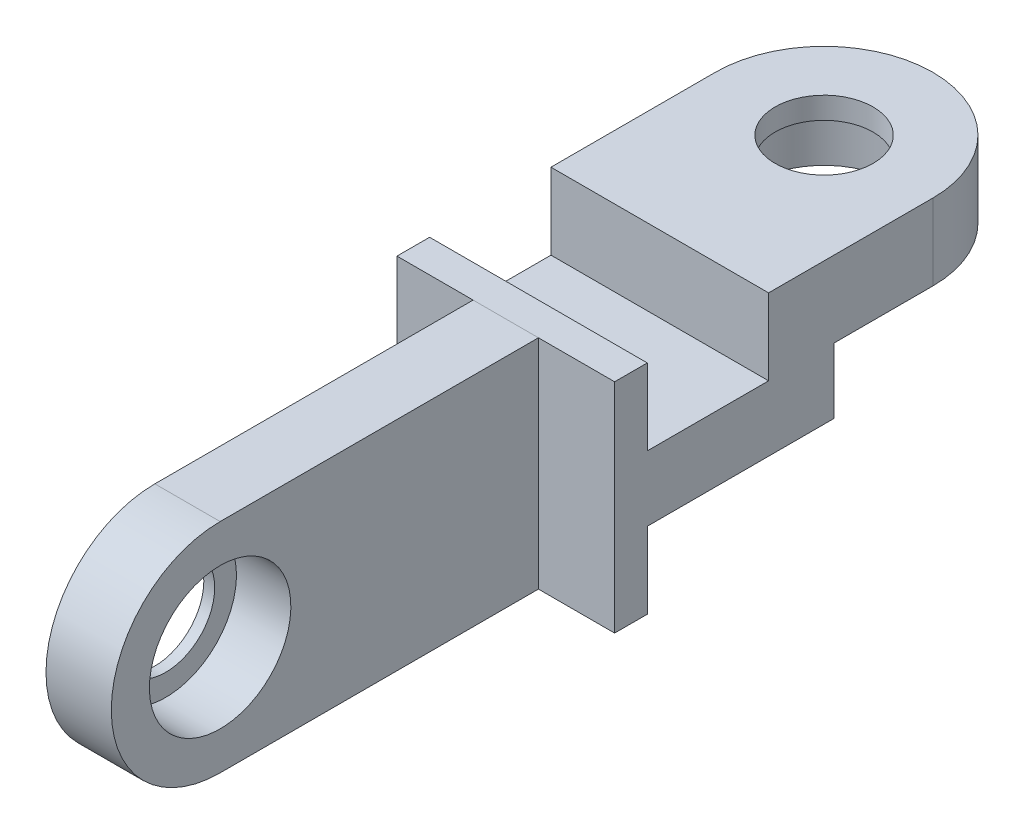
ISO-10303-21;
HEADER;
FILE_DESCRIPTION(('STEP AP214'),'2;1');
FILE_NAME('part.step','',(''),(''),'','','');
FILE_SCHEMA(('AUTOMOTIVE_DESIGN { 1 0 10303 214 1 1 1 1 }'));
ENDSEC;
DATA;
#1=APPLICATION_CONTEXT('core data for automotive mechanical design processes');
#2=APPLICATION_PROTOCOL_DEFINITION('international standard','automotive_design',2000,#1);
#3=PRODUCT_CONTEXT('',#1,'mechanical');
#4=PRODUCT('Part','Part','',(#3));
#5=PRODUCT_RELATED_PRODUCT_CATEGORY('part','',(#4));
#6=PRODUCT_DEFINITION_FORMATION('','',#4);
#7=PRODUCT_DEFINITION_CONTEXT('part definition',#1,'design');
#8=PRODUCT_DEFINITION('design','',#6,#7);
#9=PRODUCT_DEFINITION_SHAPE('','',#8);
#10=(LENGTH_UNIT() NAMED_UNIT(*) SI_UNIT(.MILLI.,.METRE.));
#11=(NAMED_UNIT(*) PLANE_ANGLE_UNIT() SI_UNIT($,.RADIAN.));
#12=(NAMED_UNIT(*) SI_UNIT($,.STERADIAN.) SOLID_ANGLE_UNIT());
#13=UNCERTAINTY_MEASURE_WITH_UNIT(LENGTH_MEASURE(1.E-05),#10,'distance_accuracy_value','');
#14=(GEOMETRIC_REPRESENTATION_CONTEXT(3) GLOBAL_UNCERTAINTY_ASSIGNED_CONTEXT((#13)) GLOBAL_UNIT_ASSIGNED_CONTEXT((#10,
#11,#12)) REPRESENTATION_CONTEXT('',''));
#15=CARTESIAN_POINT('',(0.,0.,0.));
#16=DIRECTION('',(0.,0.,1.));
#17=DIRECTION('',(1.,0.,0.));
#18=AXIS2_PLACEMENT_3D('',#15,#16,#17);
#19=CARTESIAN_POINT('',(-19.,0.,69.3946812691347));
#20=DIRECTION('',(1.,0.,0.));
#21=DIRECTION('',(0.,0.,-1.));
#22=AXIS2_PLACEMENT_3D('',#19,#20,#21);
#23=CYLINDRICAL_SURFACE('',#22,4.5);
#24=CARTESIAN_POINT('',(-3.,0.,69.3946812691347));
#25=DIRECTION('',(1.,0.,0.));
#26=DIRECTION('',(0.,0.,-1.));
#27=AXIS2_PLACEMENT_3D('',#24,#25,#26);
#28=CIRCLE('',#27,4.5);
#29=CARTESIAN_POINT('',(-3.,0.,64.8946812691347));
#30=VERTEX_POINT('',#29);
#31=EDGE_CURVE('E137',#30,#30,#28,.F.);
#32=ORIENTED_EDGE('',*,*,#31,.T.);
#33=EDGE_LOOP('',(#32));
#34=FACE_BOUND('',#33,.T.);
#35=CARTESIAN_POINT('',(-2.,0.,69.3946812691347));
#36=DIRECTION('',(1.,0.,0.));
#37=DIRECTION('',(0.,1.,0.));
#38=AXIS2_PLACEMENT_3D('',#35,#36,#37);
#39=CIRCLE('',#38,4.5);
#40=CARTESIAN_POINT('',(-2.00000000000001,4.49999999999999,69.3946812691347));
#41=VERTEX_POINT('',#40);
#42=EDGE_CURVE('E84',#41,#41,#39,.T.);
#43=ORIENTED_EDGE('',*,*,#42,.T.);
#44=EDGE_LOOP('',(#43));
#45=FACE_BOUND('',#44,.T.);
#46=ADVANCED_FACE('F80',(#34,#45),#23,.F.);
#47=CARTESIAN_POINT('',(0.,0.,40.1486937110615));
#48=DIRECTION('',(0.,0.,1.));
#49=DIRECTION('',(0.,1.,0.));
#50=AXIS2_PLACEMENT_3D('',#47,#48,#49);
#51=PLANE('',#50);
#52=DIRECTION('',(-1.,0.,0.));
#53=VECTOR('',#52,1.);
#54=CARTESIAN_POINT('',(-10.,9.99999999999997,40.1486937110615));
#55=LINE('',#54,#53);
#56=CARTESIAN_POINT('',(2.99999999999997,10.,40.1486937110615));
#57=VERTEX_POINT('',#56);
#58=CARTESIAN_POINT('',(-3.00000000000004,9.99999999999998,40.1486937110615));
#59=VERTEX_POINT('',#58);
#60=EDGE_CURVE('E14',#57,#59,#55,.T.);
#61=ORIENTED_EDGE('',*,*,#60,.F.);
#62=DIRECTION('',(0.,-1.,0.));
#63=VECTOR('',#62,1.);
#64=CARTESIAN_POINT('',(2.99999999999992,24.,40.1486937110615));
#65=LINE('',#64,#63);
#66=CARTESIAN_POINT('',(3.00000000000004,-9.99999999999999,40.1486937110615));
#67=VERTEX_POINT('',#66);
#68=EDGE_CURVE('E123',#57,#67,#65,.T.);
#69=ORIENTED_EDGE('',*,*,#68,.T.);
#70=DIRECTION('',(1.,0.,0.));
#71=VECTOR('',#70,1.);
#72=CARTESIAN_POINT('',(-9.99999999999996,-10.,40.1486937110615));
#73=LINE('',#72,#71);
#74=CARTESIAN_POINT('',(-2.99999999999997,-10.,40.1486937110615));
#75=VERTEX_POINT('',#74);
#76=EDGE_CURVE('E89',#75,#67,#73,.T.);
#77=ORIENTED_EDGE('',*,*,#76,.F.);
#78=DIRECTION('',(0.,-1.,0.));
#79=VECTOR('',#78,1.);
#80=CARTESIAN_POINT('',(-3.00000000000009,24.,40.1486937110615));
#81=LINE('',#80,#79);
#82=EDGE_CURVE('E104',#59,#75,#81,.T.);
#83=ORIENTED_EDGE('',*,*,#82,.F.);
#84=EDGE_LOOP('',(#61,#69,#77,#83));
#85=FACE_BOUND('',#84,.T.);
#86=ADVANCED_FACE('F82',(#85),#51,.F.);
#87=CARTESIAN_POINT('',(-19.,0.,69.3946812691347));
#88=DIRECTION('',(1.,0.,0.));
#89=DIRECTION('',(0.,0.,-1.));
#90=AXIS2_PLACEMENT_3D('',#87,#88,#89);
#91=CYLINDRICAL_SURFACE('',#90,10.);
#92=DIRECTION('',(1.,0.,0.));
#93=VECTOR('',#92,1.);
#94=CARTESIAN_POINT('',(-19.,-10.0000000000001,69.3946812691347));
#95=LINE('',#94,#93);
#96=CARTESIAN_POINT('',(-2.99999999999997,-10.,69.3946812691347));
#97=VERTEX_POINT('',#96);
#98=CARTESIAN_POINT('',(3.00000000000004,-9.99999999999999,69.3946812691347));
#99=VERTEX_POINT('',#98);
#100=EDGE_CURVE('E140',#97,#99,#95,.T.);
#101=ORIENTED_EDGE('',*,*,#100,.T.);
#102=CARTESIAN_POINT('',(3.,0.,69.3946812691347));
#103=DIRECTION('',(-1.,0.,0.));
#104=DIRECTION('',(0.,-1.,0.));
#105=AXIS2_PLACEMENT_3D('',#102,#103,#104);
#106=CIRCLE('',#105,10.);
#107=CARTESIAN_POINT('',(2.99999999999997,10.,69.3946812691347));
#108=VERTEX_POINT('',#107);
#109=EDGE_CURVE('E96',#99,#108,#106,.T.);
#110=ORIENTED_EDGE('',*,*,#109,.T.);
#111=DIRECTION('',(1.,0.,0.));
#112=VECTOR('',#111,1.);
#113=CARTESIAN_POINT('',(-19.,9.99999999999993,69.3946812691347));
#114=LINE('',#113,#112);
#115=CARTESIAN_POINT('',(-3.00000000000004,9.99999999999999,69.3946812691347));
#116=VERTEX_POINT('',#115);
#117=EDGE_CURVE('E144',#116,#108,#114,.T.);
#118=ORIENTED_EDGE('',*,*,#117,.F.);
#119=CARTESIAN_POINT('',(-3.,0.,69.3946812691347));
#120=DIRECTION('',(1.,0.,0.));
#121=DIRECTION('',(0.,1.,0.));
#122=AXIS2_PLACEMENT_3D('',#119,#120,#121);
#123=CIRCLE('',#122,10.);
#124=EDGE_CURVE('E150',#116,#97,#123,.T.);
#125=ORIENTED_EDGE('',*,*,#124,.T.);
#126=EDGE_LOOP('',(#101,#110,#118,#125));
#127=FACE_BOUND('',#126,.T.);
#128=ADVANCED_FACE('F183',(#127),#91,.T.);
#129=CARTESIAN_POINT('',(-10.,9.99999999999997,80.297387422123));
#130=DIRECTION('',(0.,-1.,0.));
#131=DIRECTION('',(1.,0.,0.));
#132=AXIS2_PLACEMENT_3D('',#129,#130,#131);
#133=PLANE('',#132);
#134=ORIENTED_EDGE('',*,*,#117,.T.);
#135=DIRECTION('',(0.,0.,-1.));
#136=VECTOR('',#135,1.);
#137=CARTESIAN_POINT('',(2.99999999999996,10.,80.297387422123));
#138=LINE('',#137,#136);
#139=EDGE_CURVE('E148',#108,#57,#138,.T.);
#140=ORIENTED_EDGE('',*,*,#139,.T.);
#141=ORIENTED_EDGE('',*,*,#60,.T.);
#142=DIRECTION('',(0.,0.,1.));
#143=VECTOR('',#142,1.);
#144=CARTESIAN_POINT('',(-3.00000000000004,9.99999999999999,80.297387422123));
#145=LINE('',#144,#143);
#146=EDGE_CURVE('E133',#59,#116,#145,.T.);
#147=ORIENTED_EDGE('',*,*,#146,.T.);
#148=EDGE_LOOP('',(#134,#140,#141,#147));
#149=FACE_BOUND('',#148,.T.);
#150=ADVANCED_FACE('F188',(#149),#133,.F.);
#151=CARTESIAN_POINT('',(-9.99999999999996,-10.,80.297387422123));
#152=DIRECTION('',(0.,1.,0.));
#153=DIRECTION('',(-1.,0.,0.));
#154=AXIS2_PLACEMENT_3D('',#151,#152,#153);
#155=PLANE('',#154);
#156=ORIENTED_EDGE('',*,*,#76,.T.);
#157=DIRECTION('',(0.,0.,-1.));
#158=VECTOR('',#157,1.);
#159=CARTESIAN_POINT('',(3.00000000000004,-9.99999999999999,79.3946812691347));
#160=LINE('',#159,#158);
#161=EDGE_CURVE('E120',#99,#67,#160,.T.);
#162=ORIENTED_EDGE('',*,*,#161,.F.);
#163=ORIENTED_EDGE('',*,*,#100,.F.);
#164=DIRECTION('',(0.,0.,1.));
#165=VECTOR('',#164,1.);
#166=CARTESIAN_POINT('',(-2.99999999999996,-10.,79.3946812691347));
#167=LINE('',#166,#165);
#168=EDGE_CURVE('E136',#75,#97,#167,.T.);
#169=ORIENTED_EDGE('',*,*,#168,.F.);
#170=EDGE_LOOP('',(#156,#162,#163,#169));
#171=FACE_BOUND('',#170,.T.);
#172=ADVANCED_FACE('F135',(#171),#155,.F.);
#173=CARTESIAN_POINT('',(2.99999999999992,24.,79.3946812691347));
#174=DIRECTION('',(-1.,0.,0.));
#175=DIRECTION('',(0.,-1.,0.));
#176=AXIS2_PLACEMENT_3D('',#173,#174,#175);
#177=PLANE('',#176);
#178=CARTESIAN_POINT('',(3.,0.,69.3946812691347));
#179=DIRECTION('',(1.,0.,0.));
#180=DIRECTION('',(0.,1.,0.));
#181=AXIS2_PLACEMENT_3D('',#178,#179,#180);
#182=CIRCLE('',#181,6.5);
#183=CARTESIAN_POINT('',(2.99999999999998,6.50000000000001,69.3946812691347));
#184=VERTEX_POINT('',#183);
#185=EDGE_CURVE('E156',#184,#184,#182,.T.);
#186=ORIENTED_EDGE('',*,*,#185,.F.);
#187=EDGE_LOOP('',(#186));
#188=FACE_BOUND('',#187,.T.);
#189=ORIENTED_EDGE('',*,*,#161,.T.);
#190=ORIENTED_EDGE('',*,*,#68,.F.);
#191=ORIENTED_EDGE('',*,*,#139,.F.);
#192=ORIENTED_EDGE('',*,*,#109,.F.);
#193=EDGE_LOOP('',(#189,#190,#191,#192));
#194=FACE_BOUND('',#193,.T.);
#195=ADVANCED_FACE('F122',(#188,#194),#177,.F.);
#196=CARTESIAN_POINT('',(-3.,0.,69.3946812691347));
#197=DIRECTION('',(1.,0.,0.));
#198=DIRECTION('',(0.,0.,1.));
#199=AXIS2_PLACEMENT_3D('',#196,#197,#198);
#200=PLANE('',#199);
#201=ORIENTED_EDGE('',*,*,#31,.F.);
#202=EDGE_LOOP('',(#201));
#203=FACE_BOUND('',#202,.T.);
#204=ORIENTED_EDGE('',*,*,#124,.F.);
#205=ORIENTED_EDGE('',*,*,#146,.F.);
#206=ORIENTED_EDGE('',*,*,#82,.T.);
#207=ORIENTED_EDGE('',*,*,#168,.T.);
#208=EDGE_LOOP('',(#204,#205,#206,#207));
#209=FACE_BOUND('',#208,.T.);
#210=ADVANCED_FACE('F174',(#203,#209),#200,.F.);
#211=CARTESIAN_POINT('',(-2.,0.,69.3946812691347));
#212=DIRECTION('',(1.,0.,0.));
#213=DIRECTION('',(0.,1.,0.));
#214=AXIS2_PLACEMENT_3D('',#211,#212,#213);
#215=CYLINDRICAL_SURFACE('',#214,6.5);
#216=CARTESIAN_POINT('',(-2.,0.,69.3946812691347));
#217=DIRECTION('',(1.,0.,0.));
#218=DIRECTION('',(0.,1.,0.));
#219=AXIS2_PLACEMENT_3D('',#216,#217,#218);
#220=CIRCLE('',#219,6.5);
#221=CARTESIAN_POINT('',(-2.00000000000002,6.49999999999999,69.3946812691347));
#222=VERTEX_POINT('',#221);
#223=EDGE_CURVE('E159',#222,#222,#220,.T.);
#224=ORIENTED_EDGE('',*,*,#223,.F.);
#225=EDGE_LOOP('',(#224));
#226=FACE_BOUND('',#225,.T.);
#227=ORIENTED_EDGE('',*,*,#185,.T.);
#228=EDGE_LOOP('',(#227));
#229=FACE_BOUND('',#228,.T.);
#230=ADVANCED_FACE('F169',(#226,#229),#215,.F.);
#231=CARTESIAN_POINT('',(-2.,0.,69.3946812691347));
#232=DIRECTION('',(1.,0.,0.));
#233=DIRECTION('',(0.,1.,0.));
#234=AXIS2_PLACEMENT_3D('',#231,#232,#233);
#235=PLANE('',#234);
#236=ORIENTED_EDGE('',*,*,#42,.F.);
#237=EDGE_LOOP('',(#236));
#238=FACE_BOUND('',#237,.T.);
#239=ORIENTED_EDGE('',*,*,#223,.T.);
#240=EDGE_LOOP('',(#239));
#241=FACE_BOUND('',#240,.T.);
#242=ADVANCED_FACE('F167',(#238,#241),#235,.T.);
#243=CLOSED_SHELL('',(#46,#86,#128,#150,#172,#195,#210,#230,#242));
#244=MANIFOLD_SOLID_BREP('B2',#243);
#245=CARTESIAN_POINT('',(0.,0.,40.1486937110615));
#246=DIRECTION('',(0.,0.,1.));
#247=DIRECTION('',(1.,0.,0.));
#248=AXIS2_PLACEMENT_3D('',#245,#246,#247);
#249=PLANE('',#248);
#250=DIRECTION('',(1.,0.,0.));
#251=VECTOR('',#250,1.);
#252=CARTESIAN_POINT('',(-10.,-10.,40.1486937110615));
#253=LINE('',#252,#251);
#254=CARTESIAN_POINT('',(-10.,-10.,40.1486937110615));
#255=VERTEX_POINT('',#254);
#256=CARTESIAN_POINT('',(10.,-10.,40.1486937110615));
#257=VERTEX_POINT('',#256);
#258=EDGE_CURVE('E261',#255,#257,#253,.T.);
#259=ORIENTED_EDGE('',*,*,#258,.T.);
#260=DIRECTION('',(0.,1.,0.));
#261=VECTOR('',#260,1.);
#262=CARTESIAN_POINT('',(10.,10.,40.1486937110615));
#263=LINE('',#262,#261);
#264=CARTESIAN_POINT('',(10.,10.,40.1486937110615));
#265=VERTEX_POINT('',#264);
#266=EDGE_CURVE('E359',#257,#265,#263,.T.);
#267=ORIENTED_EDGE('',*,*,#266,.T.);
#268=DIRECTION('',(-1.,0.,0.));
#269=VECTOR('',#268,1.);
#270=CARTESIAN_POINT('',(-10.,10.,40.1486937110615));
#271=LINE('',#270,#269);
#272=CARTESIAN_POINT('',(-10.,10.,40.1486937110615));
#273=VERTEX_POINT('',#272);
#274=EDGE_CURVE('E368',#265,#273,#271,.T.);
#275=ORIENTED_EDGE('',*,*,#274,.T.);
#276=DIRECTION('',(0.,-1.,0.));
#277=VECTOR('',#276,1.);
#278=CARTESIAN_POINT('',(-10.,10.,40.1486937110615));
#279=LINE('',#278,#277);
#280=EDGE_CURVE('E372',#273,#255,#279,.T.);
#281=ORIENTED_EDGE('',*,*,#280,.T.);
#282=EDGE_LOOP('',(#259,#267,#275,#281));
#283=FACE_BOUND('',#282,.T.);
#284=ADVANCED_FACE('F258',(#283),#249,.T.);
#285=CARTESIAN_POINT('',(10.,10.,80.297387422123));
#286=DIRECTION('',(-1.,0.,0.));
#287=DIRECTION('',(0.,-1.,0.));
#288=AXIS2_PLACEMENT_3D('',#285,#286,#287);
#289=PLANE('',#288);
#290=ORIENTED_EDGE('',*,*,#266,.F.);
#291=DIRECTION('',(0.,0.,-1.));
#292=VECTOR('',#291,1.);
#293=CARTESIAN_POINT('',(10.,-10.,80.297387422123));
#294=LINE('',#293,#292);
#295=CARTESIAN_POINT('',(10.,-10.,37.1486937110615));
#296=VERTEX_POINT('',#295);
#297=EDGE_CURVE('E345',#257,#296,#294,.T.);
#298=ORIENTED_EDGE('',*,*,#297,.T.);
#299=DIRECTION('',(0.,-1.,0.));
#300=VECTOR('',#299,1.);
#301=CARTESIAN_POINT('',(10.,-10.,37.1486937110615));
#302=LINE('',#301,#300);
#303=CARTESIAN_POINT('',(10.,-3.00000000000001,37.1486937110615));
#304=VERTEX_POINT('',#303);
#305=EDGE_CURVE('E441',#304,#296,#302,.T.);
#306=ORIENTED_EDGE('',*,*,#305,.F.);
#307=DIRECTION('',(0.,0.,1.));
#308=VECTOR('',#307,1.);
#309=CARTESIAN_POINT('',(10.,-3.,20.));
#310=LINE('',#309,#308);
#311=CARTESIAN_POINT('',(10.,-3.,20.));
#312=VERTEX_POINT('',#311);
#313=EDGE_CURVE('E437',#312,#304,#310,.T.);
#314=ORIENTED_EDGE('',*,*,#313,.F.);
#315=DIRECTION('',(0.,-1.,0.));
#316=VECTOR('',#315,1.);
#317=CARTESIAN_POINT('',(10.,-3.,20.));
#318=LINE('',#317,#316);
#319=CARTESIAN_POINT('',(10.,3.,20.));
#320=VERTEX_POINT('',#319);
#321=EDGE_CURVE('E433',#320,#312,#318,.T.);
#322=ORIENTED_EDGE('',*,*,#321,.F.);
#323=DIRECTION('',(0.,0.,1.));
#324=VECTOR('',#323,1.);
#325=CARTESIAN_POINT('',(10.,3.,20.));
#326=LINE('',#325,#324);
#327=CARTESIAN_POINT('',(10.,3.,10.9027061529883));
#328=VERTEX_POINT('',#327);
#329=EDGE_CURVE('E421',#328,#320,#326,.T.);
#330=ORIENTED_EDGE('',*,*,#329,.F.);
#331=DIRECTION('',(0.,-1.,0.));
#332=VECTOR('',#331,1.);
#333=CARTESIAN_POINT('',(10.,19.,10.9027061529883));
#334=LINE('',#333,#332);
#335=CARTESIAN_POINT('',(10.,10.,10.9027061529883));
#336=VERTEX_POINT('',#335);
#337=EDGE_CURVE('E267',#336,#328,#334,.T.);
#338=ORIENTED_EDGE('',*,*,#337,.F.);
#339=DIRECTION('',(0.,0.,-1.));
#340=VECTOR('',#339,1.);
#341=CARTESIAN_POINT('',(10.,10.,80.297387422123));
#342=LINE('',#341,#340);
#343=CARTESIAN_POINT('',(10.,10.,26.));
#344=VERTEX_POINT('',#343);
#345=EDGE_CURVE('E384',#344,#336,#342,.T.);
#346=ORIENTED_EDGE('',*,*,#345,.F.);
#347=DIRECTION('',(0.,1.,0.));
#348=VECTOR('',#347,1.);
#349=CARTESIAN_POINT('',(10.,10.,26.));
#350=LINE('',#349,#348);
#351=CARTESIAN_POINT('',(10.,3.,26.));
#352=VERTEX_POINT('',#351);
#353=EDGE_CURVE('E402',#352,#344,#350,.T.);
#354=ORIENTED_EDGE('',*,*,#353,.F.);
#355=DIRECTION('',(0.,0.,-1.));
#356=VECTOR('',#355,1.);
#357=CARTESIAN_POINT('',(10.,3.,26.));
#358=LINE('',#357,#356);
#359=CARTESIAN_POINT('',(10.,2.99999999999999,37.1486937110615));
#360=VERTEX_POINT('',#359);
#361=EDGE_CURVE('E412',#360,#352,#358,.T.);
#362=ORIENTED_EDGE('',*,*,#361,.F.);
#363=DIRECTION('',(0.,-1.,0.));
#364=VECTOR('',#363,1.);
#365=CARTESIAN_POINT('',(10.,10.,37.1486937110615));
#366=LINE('',#365,#364);
#367=CARTESIAN_POINT('',(10.,10.,37.1486937110615));
#368=VERTEX_POINT('',#367);
#369=EDGE_CURVE('E408',#368,#360,#366,.T.);
#370=ORIENTED_EDGE('',*,*,#369,.F.);
#371=EDGE_CURVE('E362',#265,#368,#342,.T.);
#372=ORIENTED_EDGE('',*,*,#371,.F.);
#373=EDGE_LOOP('',(#290,#298,#306,#314,#322,#330,#338,#346,#354,#362,#370,#372));
#374=FACE_BOUND('',#373,.T.);
#375=ADVANCED_FACE('F360',(#374),#289,.F.);
#376=CARTESIAN_POINT('',(-10.,10.,80.297387422123));
#377=DIRECTION('',(0.,-1.,0.));
#378=DIRECTION('',(1.,0.,0.));
#379=AXIS2_PLACEMENT_3D('',#376,#377,#378);
#380=PLANE('',#379);
#381=ORIENTED_EDGE('',*,*,#274,.F.);
#382=ORIENTED_EDGE('',*,*,#371,.T.);
#383=DIRECTION('',(1.,0.,0.));
#384=VECTOR('',#383,1.);
#385=CARTESIAN_POINT('',(-24.,10.,37.1486937110615));
#386=LINE('',#385,#384);
#387=CARTESIAN_POINT('',(-10.,10.,37.1486937110615));
#388=VERTEX_POINT('',#387);
#389=EDGE_CURVE('E424',#388,#368,#386,.T.);
#390=ORIENTED_EDGE('',*,*,#389,.F.);
#391=DIRECTION('',(0.,0.,-1.));
#392=VECTOR('',#391,1.);
#393=CARTESIAN_POINT('',(-10.,10.,80.297387422123));
#394=LINE('',#393,#392);
#395=EDGE_CURVE('E381',#273,#388,#394,.T.);
#396=ORIENTED_EDGE('',*,*,#395,.F.);
#397=EDGE_LOOP('',(#381,#382,#390,#396));
#398=FACE_BOUND('',#397,.T.);
#399=ADVANCED_FACE('F520',(#398),#380,.F.);
#400=CARTESIAN_POINT('',(-10.,10.,80.297387422123));
#401=DIRECTION('',(1.,0.,0.));
#402=DIRECTION('',(0.,1.,0.));
#403=AXIS2_PLACEMENT_3D('',#400,#401,#402);
#404=PLANE('',#403);
#405=ORIENTED_EDGE('',*,*,#280,.F.);
#406=ORIENTED_EDGE('',*,*,#395,.T.);
#407=DIRECTION('',(0.,-1.,0.));
#408=VECTOR('',#407,1.);
#409=CARTESIAN_POINT('',(-10.,10.,37.1486937110615));
#410=LINE('',#409,#408);
#411=CARTESIAN_POINT('',(-10.,2.99999999999999,37.1486937110615));
#412=VERTEX_POINT('',#411);
#413=EDGE_CURVE('E469',#388,#412,#410,.T.);
#414=ORIENTED_EDGE('',*,*,#413,.T.);
#415=DIRECTION('',(0.,0.,-1.));
#416=VECTOR('',#415,1.);
#417=CARTESIAN_POINT('',(-10.,2.99999999999999,80.297387422123));
#418=LINE('',#417,#416);
#419=CARTESIAN_POINT('',(-10.,2.99999999999999,26.));
#420=VERTEX_POINT('',#419);
#421=EDGE_CURVE('E473',#412,#420,#418,.T.);
#422=ORIENTED_EDGE('',*,*,#421,.T.);
#423=DIRECTION('',(0.,1.,0.));
#424=VECTOR('',#423,1.);
#425=CARTESIAN_POINT('',(-10.,10.,26.));
#426=LINE('',#425,#424);
#427=CARTESIAN_POINT('',(-10.,10.,26.));
#428=VERTEX_POINT('',#427);
#429=EDGE_CURVE('E477',#420,#428,#426,.T.);
#430=ORIENTED_EDGE('',*,*,#429,.T.);
#431=CARTESIAN_POINT('',(-10.,10.,10.9027061529883));
#432=VERTEX_POINT('',#431);
#433=EDGE_CURVE('E380',#428,#432,#394,.T.);
#434=ORIENTED_EDGE('',*,*,#433,.T.);
#435=DIRECTION('',(0.,-1.,0.));
#436=VECTOR('',#435,1.);
#437=CARTESIAN_POINT('',(-10.,19.,10.9027061529883));
#438=LINE('',#437,#436);
#439=CARTESIAN_POINT('',(-10.,3.,10.9027061529883));
#440=VERTEX_POINT('',#439);
#441=EDGE_CURVE('E78',#432,#440,#438,.T.);
#442=ORIENTED_EDGE('',*,*,#441,.T.);
#443=DIRECTION('',(0.,0.,1.));
#444=VECTOR('',#443,1.);
#445=CARTESIAN_POINT('',(-10.,3.00000000000001,80.297387422123));
#446=LINE('',#445,#444);
#447=CARTESIAN_POINT('',(-10.,3.,20.));
#448=VERTEX_POINT('',#447);
#449=EDGE_CURVE('E448',#440,#448,#446,.T.);
#450=ORIENTED_EDGE('',*,*,#449,.T.);
#451=DIRECTION('',(0.,-1.,0.));
#452=VECTOR('',#451,1.);
#453=CARTESIAN_POINT('',(-10.,10.,20.));
#454=LINE('',#453,#452);
#455=CARTESIAN_POINT('',(-10.,-3.,20.));
#456=VERTEX_POINT('',#455);
#457=EDGE_CURVE('E386',#448,#456,#454,.T.);
#458=ORIENTED_EDGE('',*,*,#457,.T.);
#459=DIRECTION('',(0.,0.,1.));
#460=VECTOR('',#459,1.);
#461=CARTESIAN_POINT('',(-10.,-3.00000000000003,80.297387422123));
#462=LINE('',#461,#460);
#463=CARTESIAN_POINT('',(-10.,-3.00000000000001,37.1486937110615));
#464=VERTEX_POINT('',#463);
#465=EDGE_CURVE('E465',#456,#464,#462,.T.);
#466=ORIENTED_EDGE('',*,*,#465,.T.);
#467=DIRECTION('',(0.,-1.,0.));
#468=VECTOR('',#467,1.);
#469=CARTESIAN_POINT('',(-10.,10.,37.1486937110615));
#470=LINE('',#469,#468);
#471=CARTESIAN_POINT('',(-10.,-10.,37.1486937110615));
#472=VERTEX_POINT('',#471);
#473=EDGE_CURVE('E355',#464,#472,#470,.T.);
#474=ORIENTED_EDGE('',*,*,#473,.T.);
#475=DIRECTION('',(0.,0.,-1.));
#476=VECTOR('',#475,1.);
#477=CARTESIAN_POINT('',(-10.,-10.,80.297387422123));
#478=LINE('',#477,#476);
#479=EDGE_CURVE('E356',#255,#472,#478,.T.);
#480=ORIENTED_EDGE('',*,*,#479,.F.);
#481=EDGE_LOOP('',(#405,#406,#414,#422,#430,#434,#442,#450,#458,#466,#474,#480));
#482=FACE_BOUND('',#481,.T.);
#483=ADVANCED_FACE('F492',(#482),#404,.F.);
#484=CARTESIAN_POINT('',(-10.,-10.,80.297387422123));
#485=DIRECTION('',(0.,1.,0.));
#486=DIRECTION('',(0.,0.,1.));
#487=AXIS2_PLACEMENT_3D('',#484,#485,#486);
#488=PLANE('',#487);
#489=ORIENTED_EDGE('',*,*,#258,.F.);
#490=ORIENTED_EDGE('',*,*,#479,.T.);
#491=DIRECTION('',(1.,0.,0.));
#492=VECTOR('',#491,1.);
#493=CARTESIAN_POINT('',(-24.,-10.,37.1486937110615));
#494=LINE('',#493,#492);
#495=EDGE_CURVE('E350',#472,#296,#494,.T.);
#496=ORIENTED_EDGE('',*,*,#495,.T.);
#497=ORIENTED_EDGE('',*,*,#297,.F.);
#498=EDGE_LOOP('',(#489,#490,#496,#497));
#499=FACE_BOUND('',#498,.T.);
#500=ADVANCED_FACE('F347',(#499),#488,.F.);
#501=CARTESIAN_POINT('',(0.,10.,10.9027061529883));
#502=DIRECTION('',(0.,-1.,0.));
#503=DIRECTION('',(1.,0.,0.));
#504=AXIS2_PLACEMENT_3D('',#501,#502,#503);
#505=CIRCLE('',#504,4.5);
#506=CARTESIAN_POINT('',(4.5,10.,10.9027061529883));
#507=VERTEX_POINT('',#506);
#508=EDGE_CURVE('E391',#507,#507,#505,.T.);
#509=ORIENTED_EDGE('',*,*,#508,.T.);
#510=EDGE_LOOP('',(#509));
#511=FACE_BOUND('',#510,.T.);
#512=CARTESIAN_POINT('',(0.,10.,10.9027061529883));
#513=DIRECTION('',(0.,-1.,0.));
#514=DIRECTION('',(1.,0.,0.));
#515=AXIS2_PLACEMENT_3D('',#512,#513,#514);
#516=CIRCLE('',#515,10.);
#517=EDGE_CURVE('E275',#432,#336,#516,.T.);
#518=ORIENTED_EDGE('',*,*,#517,.F.);
#519=ORIENTED_EDGE('',*,*,#433,.F.);
#520=DIRECTION('',(1.,0.,0.));
#521=VECTOR('',#520,1.);
#522=CARTESIAN_POINT('',(-24.,10.,26.));
#523=LINE('',#522,#521);
#524=EDGE_CURVE('E416',#428,#344,#523,.T.);
#525=ORIENTED_EDGE('',*,*,#524,.T.);
#526=ORIENTED_EDGE('',*,*,#345,.T.);
#527=EDGE_LOOP('',(#518,#519,#525,#526));
#528=FACE_BOUND('',#527,.T.);
#529=ADVANCED_FACE('F528',(#511,#528),#380,.F.);
#530=CARTESIAN_POINT('',(-24.,3.,20.));
#531=DIRECTION('',(0.,1.,0.));
#532=DIRECTION('',(0.,0.,1.));
#533=AXIS2_PLACEMENT_3D('',#530,#531,#532);
#534=PLANE('',#533);
#535=CARTESIAN_POINT('',(0.,3.,10.9027061529883));
#536=DIRECTION('',(0.,-1.,0.));
#537=DIRECTION('',(0.,0.,-1.));
#538=AXIS2_PLACEMENT_3D('',#535,#536,#537);
#539=CIRCLE('',#538,6.5);
#540=CARTESIAN_POINT('',(0.,3.,4.40270615298831));
#541=VERTEX_POINT('',#540);
#542=EDGE_CURVE('E397',#541,#541,#539,.T.);
#543=ORIENTED_EDGE('',*,*,#542,.F.);
#544=EDGE_LOOP('',(#543));
#545=FACE_BOUND('',#544,.T.);
#546=CARTESIAN_POINT('',(0.,3.,10.9027061529883));
#547=DIRECTION('',(0.,1.,0.));
#548=DIRECTION('',(0.,0.,1.));
#549=AXIS2_PLACEMENT_3D('',#546,#547,#548);
#550=CIRCLE('',#549,10.);
#551=EDGE_CURVE('E367',#328,#440,#550,.T.);
#552=ORIENTED_EDGE('',*,*,#551,.F.);
#553=ORIENTED_EDGE('',*,*,#329,.T.);
#554=DIRECTION('',(1.,0.,0.));
#555=VECTOR('',#554,1.);
#556=CARTESIAN_POINT('',(-24.,3.,20.));
#557=LINE('',#556,#555);
#558=EDGE_CURVE('E444',#448,#320,#557,.T.);
#559=ORIENTED_EDGE('',*,*,#558,.F.);
#560=ORIENTED_EDGE('',*,*,#449,.F.);
#561=EDGE_LOOP('',(#552,#553,#559,#560));
#562=FACE_BOUND('',#561,.T.);
#563=ADVANCED_FACE('F496',(#545,#562),#534,.F.);
#564=CARTESIAN_POINT('',(-24.,-3.,20.));
#565=DIRECTION('',(0.,1.,0.));
#566=DIRECTION('',(0.,0.,1.));
#567=AXIS2_PLACEMENT_3D('',#564,#565,#566);
#568=PLANE('',#567);
#569=DIRECTION('',(1.,0.,0.));
#570=VECTOR('',#569,1.);
#571=CARTESIAN_POINT('',(-24.,-3.,20.));
#572=LINE('',#571,#570);
#573=EDGE_CURVE('E451',#456,#312,#572,.T.);
#574=ORIENTED_EDGE('',*,*,#573,.T.);
#575=ORIENTED_EDGE('',*,*,#313,.T.);
#576=DIRECTION('',(1.,0.,0.));
#577=VECTOR('',#576,1.);
#578=CARTESIAN_POINT('',(-24.,-3.00000000000001,37.1486937110615));
#579=LINE('',#578,#577);
#580=EDGE_CURVE('E447',#464,#304,#579,.T.);
#581=ORIENTED_EDGE('',*,*,#580,.F.);
#582=ORIENTED_EDGE('',*,*,#465,.F.);
#583=EDGE_LOOP('',(#574,#575,#581,#582));
#584=FACE_BOUND('',#583,.T.);
#585=ADVANCED_FACE('F504',(#584),#568,.F.);
#586=CARTESIAN_POINT('',(-24.,-3.,20.));
#587=DIRECTION('',(0.,0.,1.));
#588=DIRECTION('',(1.,0.,0.));
#589=AXIS2_PLACEMENT_3D('',#586,#587,#588);
#590=PLANE('',#589);
#591=ORIENTED_EDGE('',*,*,#558,.T.);
#592=ORIENTED_EDGE('',*,*,#321,.T.);
#593=ORIENTED_EDGE('',*,*,#573,.F.);
#594=ORIENTED_EDGE('',*,*,#457,.F.);
#595=EDGE_LOOP('',(#591,#592,#593,#594));
#596=FACE_BOUND('',#595,.T.);
#597=ADVANCED_FACE('F499',(#596),#590,.F.);
#598=CARTESIAN_POINT('',(-24.,-10.,37.1486937110615));
#599=DIRECTION('',(0.,0.,1.));
#600=DIRECTION('',(1.,0.,0.));
#601=AXIS2_PLACEMENT_3D('',#598,#599,#600);
#602=PLANE('',#601);
#603=ORIENTED_EDGE('',*,*,#580,.T.);
#604=ORIENTED_EDGE('',*,*,#305,.T.);
#605=ORIENTED_EDGE('',*,*,#495,.F.);
#606=ORIENTED_EDGE('',*,*,#473,.F.);
#607=EDGE_LOOP('',(#603,#604,#605,#606));
#608=FACE_BOUND('',#607,.T.);
#609=ADVANCED_FACE('F506',(#608),#602,.F.);
#610=CARTESIAN_POINT('',(-24.,10.,26.));
#611=DIRECTION('',(0.,0.,-1.));
#612=DIRECTION('',(0.,1.,0.));
#613=AXIS2_PLACEMENT_3D('',#610,#611,#612);
#614=PLANE('',#613);
#615=DIRECTION('',(1.,0.,0.));
#616=VECTOR('',#615,1.);
#617=CARTESIAN_POINT('',(-24.,2.99999999999999,26.));
#618=LINE('',#617,#616);
#619=EDGE_CURVE('E417',#420,#352,#618,.T.);
#620=ORIENTED_EDGE('',*,*,#619,.T.);
#621=ORIENTED_EDGE('',*,*,#353,.T.);
#622=ORIENTED_EDGE('',*,*,#524,.F.);
#623=ORIENTED_EDGE('',*,*,#429,.F.);
#624=EDGE_LOOP('',(#620,#621,#622,#623));
#625=FACE_BOUND('',#624,.T.);
#626=ADVANCED_FACE('F508',(#625),#614,.F.);
#627=CARTESIAN_POINT('',(-24.,2.99999999999999,26.));
#628=DIRECTION('',(0.,-1.,0.));
#629=DIRECTION('',(1.,0.,0.));
#630=AXIS2_PLACEMENT_3D('',#627,#628,#629);
#631=PLANE('',#630);
#632=DIRECTION('',(1.,0.,0.));
#633=VECTOR('',#632,1.);
#634=CARTESIAN_POINT('',(-24.,2.99999999999999,37.1486937110615));
#635=LINE('',#634,#633);
#636=EDGE_CURVE('E420',#412,#360,#635,.T.);
#637=ORIENTED_EDGE('',*,*,#636,.T.);
#638=ORIENTED_EDGE('',*,*,#361,.T.);
#639=ORIENTED_EDGE('',*,*,#619,.F.);
#640=ORIENTED_EDGE('',*,*,#421,.F.);
#641=EDGE_LOOP('',(#637,#638,#639,#640));
#642=FACE_BOUND('',#641,.T.);
#643=ADVANCED_FACE('F514',(#642),#631,.F.);
#644=CARTESIAN_POINT('',(-24.,10.,37.1486937110615));
#645=DIRECTION('',(0.,0.,1.));
#646=DIRECTION('',(1.,0.,0.));
#647=AXIS2_PLACEMENT_3D('',#644,#645,#646);
#648=PLANE('',#647);
#649=ORIENTED_EDGE('',*,*,#389,.T.);
#650=ORIENTED_EDGE('',*,*,#369,.T.);
#651=ORIENTED_EDGE('',*,*,#636,.F.);
#652=ORIENTED_EDGE('',*,*,#413,.F.);
#653=EDGE_LOOP('',(#649,#650,#651,#652));
#654=FACE_BOUND('',#653,.T.);
#655=ADVANCED_FACE('F555',(#654),#648,.F.);
#656=CARTESIAN_POINT('',(0.,8.,10.9027061529883));
#657=DIRECTION('',(0.,-1.,0.));
#658=DIRECTION('',(0.,0.,-1.));
#659=AXIS2_PLACEMENT_3D('',#656,#657,#658);
#660=CYLINDRICAL_SURFACE('',#659,6.5);
#661=CARTESIAN_POINT('',(0.,8.,10.9027061529883));
#662=DIRECTION('',(0.,-1.,0.));
#663=DIRECTION('',(0.,0.,-1.));
#664=AXIS2_PLACEMENT_3D('',#661,#662,#663);
#665=CIRCLE('',#664,6.5);
#666=CARTESIAN_POINT('',(0.,8.,4.40270615298831));
#667=VERTEX_POINT('',#666);
#668=EDGE_CURVE('E398',#667,#667,#665,.T.);
#669=ORIENTED_EDGE('',*,*,#668,.F.);
#670=EDGE_LOOP('',(#669));
#671=FACE_BOUND('',#670,.T.);
#672=ORIENTED_EDGE('',*,*,#542,.T.);
#673=EDGE_LOOP('',(#672));
#674=FACE_BOUND('',#673,.T.);
#675=ADVANCED_FACE('F558',(#671,#674),#660,.F.);
#676=CARTESIAN_POINT('',(0.,8.,10.9027061529883));
#677=DIRECTION('',(0.,-1.,0.));
#678=DIRECTION('',(0.,0.,-1.));
#679=AXIS2_PLACEMENT_3D('',#676,#677,#678);
#680=PLANE('',#679);
#681=CARTESIAN_POINT('',(0.,8.,10.9027061529883));
#682=DIRECTION('',(0.,-1.,0.));
#683=DIRECTION('',(0.,0.,-1.));
#684=AXIS2_PLACEMENT_3D('',#681,#682,#683);
#685=CIRCLE('',#684,4.5);
#686=CARTESIAN_POINT('',(0.,8.,6.40270615298832));
#687=VERTEX_POINT('',#686);
#688=EDGE_CURVE('E390',#687,#687,#685,.T.);
#689=ORIENTED_EDGE('',*,*,#688,.F.);
#690=EDGE_LOOP('',(#689));
#691=FACE_BOUND('',#690,.T.);
#692=ORIENTED_EDGE('',*,*,#668,.T.);
#693=EDGE_LOOP('',(#692));
#694=FACE_BOUND('',#693,.T.);
#695=ADVANCED_FACE('F564',(#691,#694),#680,.T.);
#696=CARTESIAN_POINT('',(0.,19.,10.9027061529883));
#697=DIRECTION('',(0.,-1.,0.));
#698=DIRECTION('',(0.,0.,-1.));
#699=AXIS2_PLACEMENT_3D('',#696,#697,#698);
#700=CYLINDRICAL_SURFACE('',#699,4.5);
#701=ORIENTED_EDGE('',*,*,#688,.T.);
#702=EDGE_LOOP('',(#701));
#703=FACE_BOUND('',#702,.T.);
#704=ORIENTED_EDGE('',*,*,#508,.F.);
#705=EDGE_LOOP('',(#704));
#706=FACE_BOUND('',#705,.T.);
#707=ADVANCED_FACE('F571',(#703,#706),#700,.F.);
#708=CARTESIAN_POINT('',(0.,19.,10.9027061529883));
#709=DIRECTION('',(0.,-1.,0.));
#710=DIRECTION('',(0.,0.,-1.));
#711=AXIS2_PLACEMENT_3D('',#708,#709,#710);
#712=CYLINDRICAL_SURFACE('',#711,10.);
#713=ORIENTED_EDGE('',*,*,#517,.T.);
#714=ORIENTED_EDGE('',*,*,#337,.T.);
#715=ORIENTED_EDGE('',*,*,#551,.T.);
#716=ORIENTED_EDGE('',*,*,#441,.F.);
#717=EDGE_LOOP('',(#713,#714,#715,#716));
#718=FACE_BOUND('',#717,.T.);
#719=ADVANCED_FACE('F486',(#718),#712,.T.);
#720=CLOSED_SHELL('',(#284,#375,#399,#483,#500,#529,#563,#585,#597,#609,#626,#643,#655,#675,
#695,#707,#719));
#721=MANIFOLD_SOLID_BREP('B8',#720);
#722=ADVANCED_BREP_SHAPE_REPRESENTATION('',(#18,#244,#721),#14);
#723=SHAPE_DEFINITION_REPRESENTATION(#9,#722);
ENDSEC;
END-ISO-10303-21;
